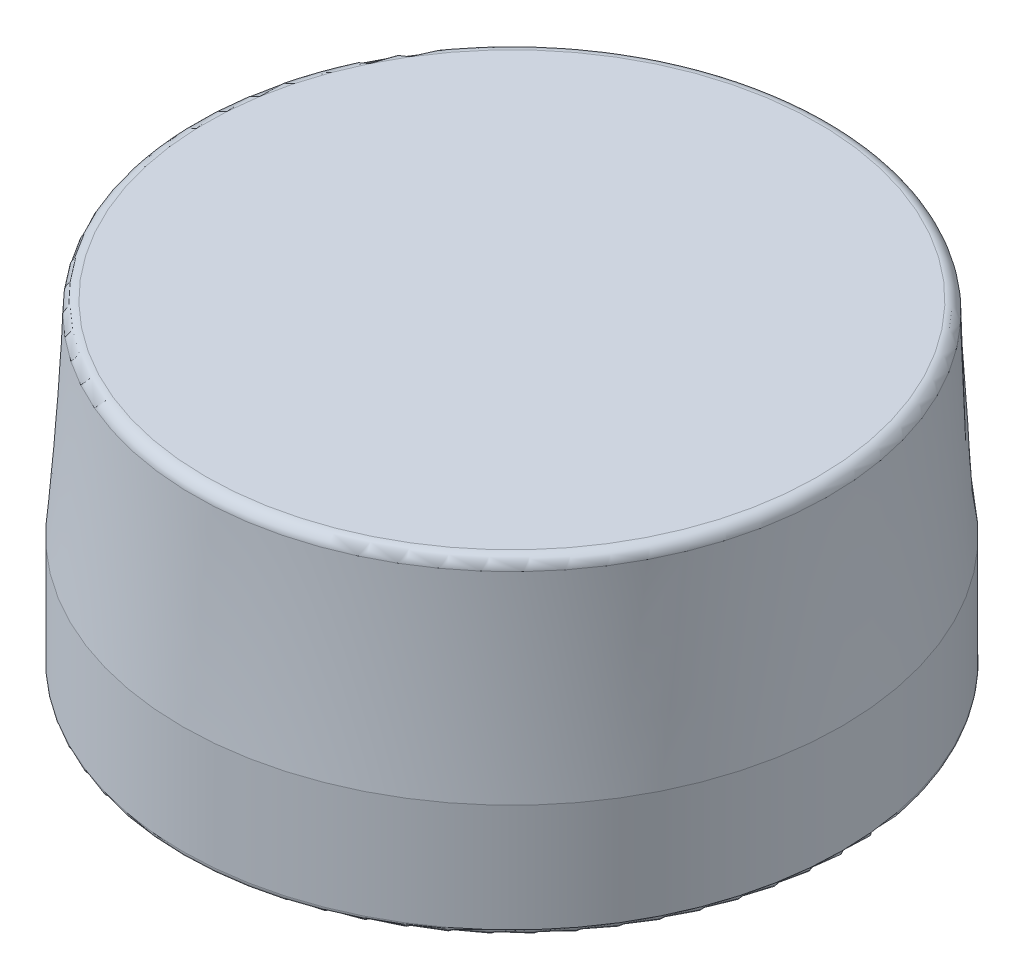
ISO-10303-21;
HEADER;
FILE_DESCRIPTION(('STEP AP214'),'2;1');
FILE_NAME('part.step','',(''),(''),'','','');
FILE_SCHEMA(('AUTOMOTIVE_DESIGN { 1 0 10303 214 1 1 1 1 }'));
ENDSEC;
DATA;
#1=APPLICATION_CONTEXT('core data for automotive mechanical design processes');
#2=APPLICATION_PROTOCOL_DEFINITION('international standard','automotive_design',2000,#1);
#3=PRODUCT_CONTEXT('',#1,'mechanical');
#4=PRODUCT('Part','Part','',(#3));
#5=PRODUCT_RELATED_PRODUCT_CATEGORY('part','',(#4));
#6=PRODUCT_DEFINITION_FORMATION('','',#4);
#7=PRODUCT_DEFINITION_CONTEXT('part definition',#1,'design');
#8=PRODUCT_DEFINITION('design','',#6,#7);
#9=PRODUCT_DEFINITION_SHAPE('','',#8);
#10=(LENGTH_UNIT() NAMED_UNIT(*) SI_UNIT(.MILLI.,.METRE.));
#11=(NAMED_UNIT(*) PLANE_ANGLE_UNIT() SI_UNIT($,.RADIAN.));
#12=(NAMED_UNIT(*) SI_UNIT($,.STERADIAN.) SOLID_ANGLE_UNIT());
#13=UNCERTAINTY_MEASURE_WITH_UNIT(LENGTH_MEASURE(1.E-05),#10,'distance_accuracy_value','');
#14=(GEOMETRIC_REPRESENTATION_CONTEXT(3) GLOBAL_UNCERTAINTY_ASSIGNED_CONTEXT((#13)) GLOBAL_UNIT_ASSIGNED_CONTEXT((#10,
#11,#12)) REPRESENTATION_CONTEXT('',''));
#15=CARTESIAN_POINT('',(0.,0.,0.));
#16=DIRECTION('',(0.,0.,1.));
#17=DIRECTION('',(1.,0.,0.));
#18=AXIS2_PLACEMENT_3D('',#15,#16,#17);
#19=CARTESIAN_POINT('',(0.,23.,0.));
#20=DIRECTION('',(0.,-1.,0.));
#21=DIRECTION('',(0.,0.,-1.));
#22=AXIS2_PLACEMENT_3D('',#19,#20,#21);
#23=CYLINDRICAL_SURFACE('',#22,26.);
#24=CARTESIAN_POINT('',(0.,0.,0.));
#25=DIRECTION('',(0.,1.,0.));
#26=DIRECTION('',(0.,0.,1.));
#27=AXIS2_PLACEMENT_3D('',#24,#25,#26);
#28=CIRCLE('',#27,26.);
#29=CARTESIAN_POINT('',(0.,0.,26.));
#30=VERTEX_POINT('',#29);
#31=EDGE_CURVE('E62',#30,#30,#28,.T.);
#32=ORIENTED_EDGE('',*,*,#31,.F.);
#33=EDGE_LOOP('',(#32));
#34=FACE_BOUND('',#33,.T.);
#35=CARTESIAN_POINT('',(0.,22.,0.));
#36=DIRECTION('',(0.,-1.,0.));
#37=DIRECTION('',(0.,0.,-1.));
#38=AXIS2_PLACEMENT_3D('',#35,#36,#37);
#39=CIRCLE('',#38,26.);
#40=CARTESIAN_POINT('',(0.,22.,-26.));
#41=VERTEX_POINT('',#40);
#42=EDGE_CURVE('E68',#41,#41,#39,.T.);
#43=ORIENTED_EDGE('',*,*,#42,.F.);
#44=EDGE_LOOP('',(#43));
#45=FACE_BOUND('',#44,.T.);
#46=ADVANCED_FACE('F33',(#34,#45),#23,.F.);
#47=CARTESIAN_POINT('',(0.,0.,0.));
#48=DIRECTION('',(0.,1.,0.));
#49=DIRECTION('',(0.,0.,1.));
#50=AXIS2_PLACEMENT_3D('',#47,#48,#49);
#51=PLANE('',#50);
#52=ORIENTED_EDGE('',*,*,#31,.T.);
#53=EDGE_LOOP('',(#52));
#54=FACE_BOUND('',#53,.T.);
#55=CARTESIAN_POINT('',(0.,0.,0.));
#56=DIRECTION('',(0.,1.,0.));
#57=DIRECTION('',(0.,0.,1.));
#58=AXIS2_PLACEMENT_3D('',#55,#56,#57);
#59=CIRCLE('',#58,27.9);
#60=CARTESIAN_POINT('',(0.,0.,27.9));
#61=VERTEX_POINT('',#60);
#62=EDGE_CURVE('E59',#61,#61,#59,.T.);
#63=ORIENTED_EDGE('',*,*,#62,.F.);
#64=EDGE_LOOP('',(#63));
#65=FACE_BOUND('',#64,.T.);
#66=ADVANCED_FACE('F75',(#54,#65),#51,.F.);
#67=CARTESIAN_POINT('',(0.,5.,0.));
#68=DIRECTION('',(0.,-1.,0.));
#69=DIRECTION('',(0.,0.,-1.));
#70=AXIS2_PLACEMENT_3D('',#67,#68,#69);
#71=CYLINDRICAL_SURFACE('',#70,29.);
#72=CARTESIAN_POINT('',(0.,-4.5,0.));
#73=DIRECTION('',(0.,1.,0.));
#74=DIRECTION('',(0.,0.,1.));
#75=AXIS2_PLACEMENT_3D('',#72,#73,#74);
#76=CIRCLE('',#75,29.);
#77=CARTESIAN_POINT('',(0.,-4.5,29.));
#78=VERTEX_POINT('',#77);
#79=EDGE_CURVE('E48',#78,#78,#76,.T.);
#80=ORIENTED_EDGE('',*,*,#79,.T.);
#81=EDGE_LOOP('',(#80));
#82=FACE_BOUND('',#81,.T.);
#83=CARTESIAN_POINT('',(0.,5.,0.));
#84=DIRECTION('',(0.,1.,0.));
#85=DIRECTION('',(0.,0.,1.));
#86=AXIS2_PLACEMENT_3D('',#83,#84,#85);
#87=CIRCLE('',#86,29.);
#88=CARTESIAN_POINT('',(27.9087274893966,5.,7.88054122015723));
#89=VERTEX_POINT('',#88);
#90=EDGE_CURVE('E65',#89,#89,#87,.T.);
#91=ORIENTED_EDGE('',*,*,#90,.F.);
#92=EDGE_LOOP('',(#91));
#93=FACE_BOUND('',#92,.T.);
#94=ADVANCED_FACE('F81',(#82,#93),#71,.T.);
#95=CARTESIAN_POINT('',(0.,-5.,0.));
#96=DIRECTION('',(0.,1.,0.));
#97=DIRECTION('',(0.,0.,1.));
#98=AXIS2_PLACEMENT_3D('',#95,#96,#97);
#99=CYLINDRICAL_SURFACE('',#98,27.9);
#100=CARTESIAN_POINT('',(0.,-4.5,0.));
#101=DIRECTION('',(0.,1.,0.));
#102=DIRECTION('',(0.,0.,1.));
#103=AXIS2_PLACEMENT_3D('',#100,#101,#102);
#104=CIRCLE('',#103,27.9);
#105=CARTESIAN_POINT('',(0.,-4.5,27.9));
#106=VERTEX_POINT('',#105);
#107=EDGE_CURVE('E11',#106,#106,#104,.F.);
#108=ORIENTED_EDGE('',*,*,#107,.T.);
#109=EDGE_LOOP('',(#108));
#110=FACE_BOUND('',#109,.T.);
#111=ORIENTED_EDGE('',*,*,#62,.T.);
#112=EDGE_LOOP('',(#111));
#113=FACE_BOUND('',#112,.T.);
#114=ADVANCED_FACE('F102',(#110,#113),#99,.F.);
#115=CARTESIAN_POINT('',(0.,-5.,0.));
#116=DIRECTION('',(0.,1.,0.));
#117=DIRECTION('',(0.,0.,1.));
#118=AXIS2_PLACEMENT_3D('',#115,#116,#117);
#119=PLANE('',#118);
#120=CARTESIAN_POINT('',(0.,-5.,0.));
#121=DIRECTION('',(0.,1.,0.));
#122=DIRECTION('',(0.,0.,1.));
#123=AXIS2_PLACEMENT_3D('',#120,#121,#122);
#124=CIRCLE('',#123,28.5);
#125=CARTESIAN_POINT('',(0.,-5.,28.5));
#126=VERTEX_POINT('',#125);
#127=EDGE_CURVE('E40',#126,#126,#124,.F.);
#128=ORIENTED_EDGE('',*,*,#127,.T.);
#129=EDGE_LOOP('',(#128));
#130=FACE_BOUND('',#129,.T.);
#131=CARTESIAN_POINT('',(0.,-5.,0.));
#132=DIRECTION('',(0.,1.,0.));
#133=DIRECTION('',(0.,0.,1.));
#134=AXIS2_PLACEMENT_3D('',#131,#132,#133);
#135=CIRCLE('',#134,28.4);
#136=CARTESIAN_POINT('',(0.,-5.,28.4));
#137=VERTEX_POINT('',#136);
#138=EDGE_CURVE('E44',#137,#137,#135,.T.);
#139=ORIENTED_EDGE('',*,*,#138,.T.);
#140=EDGE_LOOP('',(#139));
#141=FACE_BOUND('',#140,.T.);
#142=ADVANCED_FACE('F109',(#130,#141),#119,.F.);
#143=CARTESIAN_POINT('',(27.7794563342098,23.,2.59071530194459));
#144=CARTESIAN_POINT('',(27.9087274893966,5.,7.88054122015723));
#145=CARTESIAN_POINT('',(22.5980257303206,23.,58.1496279703642));
#146=CARTESIAN_POINT('',(12.1476450490822,5.,63.6979961989505));
#147=CARTESIAN_POINT('',(-32.960886938099,23.,52.968197366475));
#148=CARTESIAN_POINT('',(-43.6698099297111,5.,47.936913758636));
#149=CARTESIAN_POINT('',(-27.7794563342098,23.,-2.59071530194459));
#150=CARTESIAN_POINT('',(-27.9087274893966,5.,-7.88054122015723));
#151=CARTESIAN_POINT('',(-22.5980257303206,23.,-58.1496279703642));
#152=CARTESIAN_POINT('',(-12.1476450490822,5.,-63.6979961989504));
#153=CARTESIAN_POINT('',(32.960886938099,23.,-52.9681973664751));
#154=CARTESIAN_POINT('',(43.6698099297111,5.,-47.936913758636));
#155=CARTESIAN_POINT('',(27.7794563342098,23.,2.59071530194459));
#156=CARTESIAN_POINT('',(27.9087274893966,5.,7.88054122015723));
#157=(BOUNDED_SURFACE() B_SPLINE_SURFACE(3,1,((#143,#144),(#145,#146),(#147,#148),(#149,#150),
(#151,#152),(#153,#154),(#155,#156)),.UNSPECIFIED.,.T.,.F.,.F.) B_SPLINE_SURFACE_WITH_KNOTS((4,
3,4),(2,2),(0.,0.5,1.),(0.,1.),
.UNSPECIFIED.) GEOMETRIC_REPRESENTATION_ITEM() RATIONAL_B_SPLINE_SURFACE(((1.,1.),
(0.333333333333333,0.333333333333333),(0.333333333333333,0.333333333333333),(1.,1.),
(0.333333333333333,0.333333333333334),(0.333333333333333,0.333333333333334),(1.,1.))) REPRESENTATION_ITEM('') SURFACE());
#158=CARTESIAN_POINT('',(0.,22.0373487993445,0.));
#159=DIRECTION('',(0.,-1.,0.));
#160=DIRECTION('',(0.,0.,-1.));
#161=AXIS2_PLACEMENT_3D('',#158,#159,#160);
#162=CIRCLE('',#161,27.9345669709485);
#163=CARTESIAN_POINT('',(27.7863698360293,22.0373487993445,2.87361848369049));
#164=VERTEX_POINT('',#163);
#165=EDGE_CURVE('E53',#164,#164,#162,.T.);
#166=CARTESIAN_POINT('',(27.7863698360293,22.0373487993445,2.87361848369049));
#167=CARTESIAN_POINT('',(27.7876443949186,21.859876416018,2.92577392886202));
#168=CARTESIAN_POINT('',(27.7889189538078,21.6824040326914,2.97792937403354));
#169=CARTESIAN_POINT('',(27.7914680715863,21.3274592660384,3.0822402643766));
#170=CARTESIAN_POINT('',(27.7927426304755,21.1499868827119,3.13439570954813));
#171=CARTESIAN_POINT('',(27.795291748254,20.7950421160589,3.23870659989119));
#172=CARTESIAN_POINT('',(27.7965663071432,20.6175697327324,3.29086204506272));
#173=CARTESIAN_POINT('',(27.7991154249217,20.2626249660794,3.39517293540577));
#174=CARTESIAN_POINT('',(27.800389983811,20.0851525827529,3.4473283805773));
#175=CARTESIAN_POINT('',(27.8029391015895,19.7302078160999,3.55163927092036));
#176=CARTESIAN_POINT('',(27.8042136604787,19.5527354327734,3.60379471609189));
#177=CARTESIAN_POINT('',(27.8067627782572,19.1977906661204,3.70810560643494));
#178=CARTESIAN_POINT('',(27.8080373371464,19.0203182827939,3.76026105160647));
#179=CARTESIAN_POINT('',(27.8105864549249,18.6653735161409,3.86457194194953));
#180=CARTESIAN_POINT('',(27.8118610138142,18.4879011328144,3.91672738712106));
#181=CARTESIAN_POINT('',(27.8144101315926,18.1329563661614,4.02103827746412));
#182=CARTESIAN_POINT('',(27.8156846904819,17.9554839828348,4.07319372263564));
#183=CARTESIAN_POINT('',(27.8182338082604,17.6005392161818,4.1775046129787));
#184=CARTESIAN_POINT('',(27.8195083671496,17.4230668328553,4.22966005815023));
#185=CARTESIAN_POINT('',(27.8220574849281,17.0681220662023,4.33397094849329));
#186=CARTESIAN_POINT('',(27.8233320438173,16.8906496828758,4.38612639366481));
#187=CARTESIAN_POINT('',(27.8258811615958,16.5357049162228,4.49043728400787));
#188=CARTESIAN_POINT('',(27.8271557204851,16.3582325328963,4.5425927291794));
#189=CARTESIAN_POINT('',(27.8297048382636,16.0032877662433,4.64690361952246));
#190=CARTESIAN_POINT('',(27.8309793971528,15.8258153829168,4.69905906469399));
#191=CARTESIAN_POINT('',(27.8335285149313,15.4708706162638,4.80336995503704));
#192=CARTESIAN_POINT('',(27.8348030738205,15.2933982329373,4.85552540020857));
#193=CARTESIAN_POINT('',(27.837352191599,14.9384534662843,4.95983629055163));
#194=CARTESIAN_POINT('',(27.8386267504883,14.7609810829578,5.01199173572316));
#195=CARTESIAN_POINT('',(27.8411758682667,14.4060363163048,5.11630262606621));
#196=CARTESIAN_POINT('',(27.842450427156,14.2285639329782,5.16845807123774));
#197=CARTESIAN_POINT('',(27.8449995449345,13.8736191663252,5.2727689615808));
#198=CARTESIAN_POINT('',(27.8462741038237,13.6961467829987,5.32492440675233));
#199=CARTESIAN_POINT('',(27.8488232216022,13.3412020163457,5.42923529709539));
#200=CARTESIAN_POINT('',(27.8500977804914,13.1637296330192,5.48139074226691));
#201=CARTESIAN_POINT('',(27.8526468982699,12.8087848663662,5.58570163260997));
#202=CARTESIAN_POINT('',(27.8539214571592,12.6313124830397,5.6378570777815));
#203=CARTESIAN_POINT('',(27.8564705749377,12.2763677163867,5.74216796812456));
#204=CARTESIAN_POINT('',(27.8577451338269,12.0988953330602,5.79432341329609));
#205=CARTESIAN_POINT('',(27.8602942516054,11.7439505664072,5.89863430363914));
#206=CARTESIAN_POINT('',(27.8615688104946,11.5664781830807,5.95078974881067));
#207=CARTESIAN_POINT('',(27.8641179282731,11.2115334164277,6.05510063915373));
#208=CARTESIAN_POINT('',(27.8653924871624,11.0340610331012,6.10725608432526));
#209=CARTESIAN_POINT('',(27.8679416049408,10.6791162664482,6.21156697466832));
#210=CARTESIAN_POINT('',(27.8692161638301,10.5016438831216,6.26372241983984));
#211=CARTESIAN_POINT('',(27.8717652816086,10.1466991164686,6.3680333101829));
#212=CARTESIAN_POINT('',(27.8730398404978,9.96922673314213,6.42018875535443));
#213=CARTESIAN_POINT('',(27.8755889582763,9.61428196648912,6.52449964569749));
#214=CARTESIAN_POINT('',(27.8768635171656,9.43680958316262,6.57665509086902));
#215=CARTESIAN_POINT('',(27.879412634944,9.08186481650961,6.68096598121207));
#216=CARTESIAN_POINT('',(27.8806871938333,8.90439243318311,6.7331214263836));
#217=CARTESIAN_POINT('',(27.8832363116118,8.5494476665301,6.83743231672666));
#218=CARTESIAN_POINT('',(27.884510870501,8.37197528320359,6.88958776189819));
#219=CARTESIAN_POINT('',(27.8870599882795,8.01703051655058,6.99389865224124));
#220=CARTESIAN_POINT('',(27.8883345471687,7.83955813322408,7.04605409741277));
#221=CARTESIAN_POINT('',(27.8908836649472,7.48461336657107,7.15036498775583));
#222=CARTESIAN_POINT('',(27.8921582238365,7.30714098324456,7.20252043292736));
#223=CARTESIAN_POINT('',(27.894707341615,6.95219621659155,7.30683132327042));
#224=CARTESIAN_POINT('',(27.8959819005042,6.77472383326505,7.35898676844194));
#225=CARTESIAN_POINT('',(27.8985310182827,6.41977906661204,7.463297658785));
#226=CARTESIAN_POINT('',(27.8998055771719,6.24230668328553,7.51545310395653));
#227=CARTESIAN_POINT('',(27.9023546949504,5.88736191663252,7.61976399429959));
#228=CARTESIAN_POINT('',(27.9036292538397,5.70988953330602,7.67191943947112));
#229=CARTESIAN_POINT('',(27.9061783716181,5.35494476665301,7.77623032981417));
#230=CARTESIAN_POINT('',(27.9074529305074,5.1774723833265,7.8283857749857));
#231=CARTESIAN_POINT('',(27.9087274893966,5.,7.88054122015723));
#232=B_SPLINE_CURVE_WITH_KNOTS('',3,(#166,#167,#168,#169,#170,#171,#172,#173,#174,#175,#176,
#177,#178,#179,#180,#181,#182,#183,#184,#185,#186,#187,#188,#189,#190,#191,#192,#193,#194,#195,
#196,#197,#198,#199,#200,#201,#202,#203,#204,#205,#206,#207,#208,#209,#210,#211,#212,#213,#214,
#215,#216,#217,#218,#219,#220,#221,#222,#223,#224,#225,#226,#227,#228,#229,#230,#231),
.UNSPECIFIED.,.F.,.F.,(4,2,2,2,2,2,2,2,2,2,2,2,2,2,2,2,2,2,2,2,2,2,2,2,2,2,2,2,2,2,2,2,4),(0.,
0.554945363297084,1.10989072659416,1.66483608989125,2.21978145318833,2.77472681648541,
3.32967217978249,3.88461754307958,4.43956290637666,4.99450826967374,5.54945363297082,
6.1043989962679,6.65934435956499,7.21428972286207,7.76923508615916,8.32418044945624,
8.87912581275332,9.4340711760504,9.98901653934748,10.5439619026446,11.0989072659416,
11.6538526292387,12.2087979925358,12.7637433558329,13.31868871913,13.8736340824271,
14.4285794457241,14.9835248090212,15.5384701723183,16.0934155356154,16.6483608989125,
17.2033062622095,17.7582516255066),.UNSPECIFIED.);
#233=EDGE_CURVE('BSEAM106',#164,#89,#232,.T.);
#234=ORIENTED_EDGE('',*,*,#165,.T.);
#235=ORIENTED_EDGE('',*,*,#90,.T.);
#236=ORIENTED_EDGE('',*,*,#233,.T.);
#237=ORIENTED_EDGE('',*,*,#233,.F.);
#238=EDGE_LOOP('',(#234,#236,#235,#237));
#239=FACE_BOUND('',#238,.T.);
#240=ADVANCED_FACE('F106',(#239),#157,.T.);
#241=CARTESIAN_POINT('',(0.,23.,0.));
#242=DIRECTION('',(0.,1.,0.));
#243=DIRECTION('',(0.,0.,1.));
#244=AXIS2_PLACEMENT_3D('',#241,#242,#243);
#245=PLANE('',#244);
#246=CARTESIAN_POINT('',(0.,23.,0.));
#247=DIRECTION('',(0.,1.,0.));
#248=DIRECTION('',(0.,0.,1.));
#249=AXIS2_PLACEMENT_3D('',#246,#247,#248);
#250=CIRCLE('',#249,26.9352646807542);
#251=CARTESIAN_POINT('',(0.,23.,26.9352646807542));
#252=VERTEX_POINT('',#251);
#253=EDGE_CURVE('E56',#252,#252,#250,.T.);
#254=ORIENTED_EDGE('',*,*,#253,.T.);
#255=EDGE_LOOP('',(#254));
#256=FACE_BOUND('',#255,.T.);
#257=ADVANCED_FACE('F108',(#256),#245,.T.);
#258=CARTESIAN_POINT('',(0.,22.,0.));
#259=DIRECTION('',(0.,-1.,0.));
#260=DIRECTION('',(0.,0.,-1.));
#261=AXIS2_PLACEMENT_3D('',#258,#259,#260);
#262=PLANE('',#261);
#263=ORIENTED_EDGE('',*,*,#42,.T.);
#264=EDGE_LOOP('',(#263));
#265=FACE_BOUND('',#264,.T.);
#266=ADVANCED_FACE('F72',(#265),#262,.T.);
#267=CARTESIAN_POINT('',(0.,22.,0.));
#268=DIRECTION('',(0.,-1.,0.));
#269=DIRECTION('',(0.,0.,-1.));
#270=AXIS2_PLACEMENT_3D('',#267,#268,#269);
#271=TOROIDAL_SURFACE('',#270,26.9352646807542,1.);
#272=ORIENTED_EDGE('',*,*,#165,.F.);
#273=EDGE_LOOP('',(#272));
#274=FACE_BOUND('',#273,.T.);
#275=ORIENTED_EDGE('',*,*,#253,.F.);
#276=EDGE_LOOP('',(#275));
#277=FACE_BOUND('',#276,.T.);
#278=ADVANCED_FACE('F87',(#274,#277),#271,.T.);
#279=CARTESIAN_POINT('',(0.,-4.5,0.));
#280=DIRECTION('',(0.,1.,0.));
#281=DIRECTION('',(0.,0.,1.));
#282=AXIS2_PLACEMENT_3D('',#279,#280,#281);
#283=TOROIDAL_SURFACE('',#282,28.5,0.5);
#284=ORIENTED_EDGE('',*,*,#127,.F.);
#285=EDGE_LOOP('',(#284));
#286=FACE_BOUND('',#285,.T.);
#287=ORIENTED_EDGE('',*,*,#79,.F.);
#288=EDGE_LOOP('',(#287));
#289=FACE_BOUND('',#288,.T.);
#290=ADVANCED_FACE('F89',(#286,#289),#283,.T.);
#291=CARTESIAN_POINT('',(0.,-4.5,0.));
#292=DIRECTION('',(0.,1.,0.));
#293=DIRECTION('',(0.,0.,1.));
#294=AXIS2_PLACEMENT_3D('',#291,#292,#293);
#295=TOROIDAL_SURFACE('',#294,28.4,0.5);
#296=ORIENTED_EDGE('',*,*,#107,.F.);
#297=EDGE_LOOP('',(#296));
#298=FACE_BOUND('',#297,.T.);
#299=ORIENTED_EDGE('',*,*,#138,.F.);
#300=EDGE_LOOP('',(#299));
#301=FACE_BOUND('',#300,.T.);
#302=ADVANCED_FACE('F35',(#298,#301),#295,.T.);
#303=CLOSED_SHELL('',(#46,#66,#94,#114,#142,#240,#257,#266,#278,#290,#302));
#304=MANIFOLD_SOLID_BREP('B2',#303);
#305=ADVANCED_BREP_SHAPE_REPRESENTATION('',(#18,#304),#14);
#306=SHAPE_DEFINITION_REPRESENTATION(#9,#305);
ENDSEC;
END-ISO-10303-21;
